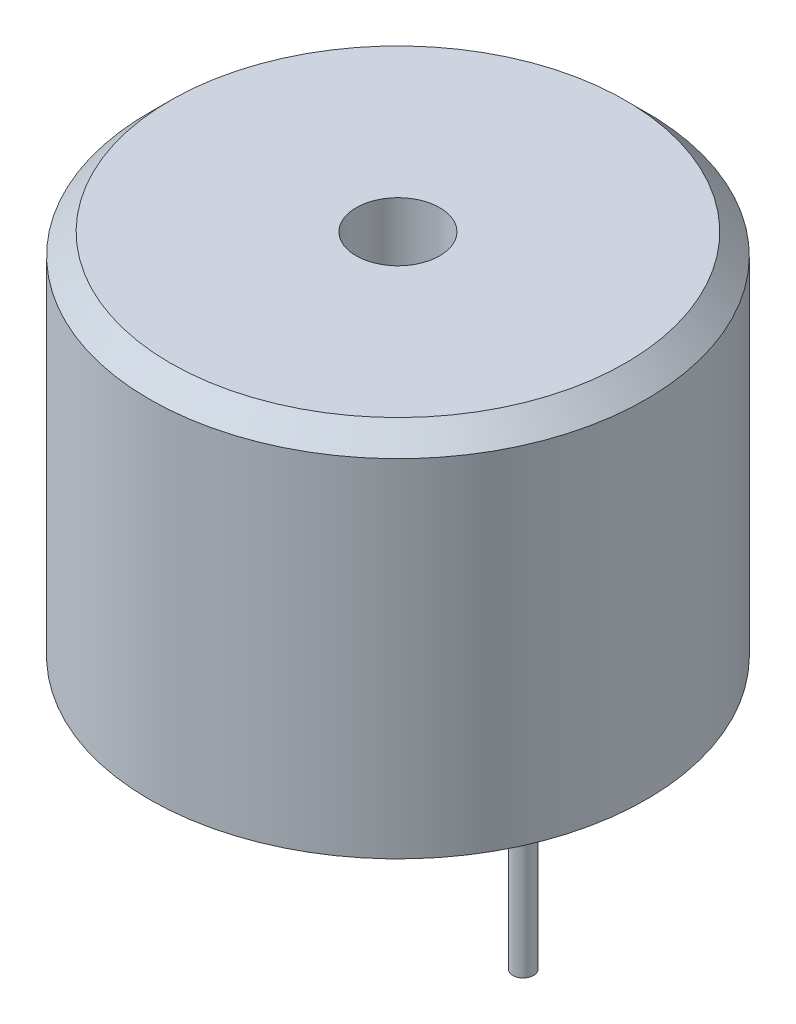
ISO-10303-21;
HEADER;
FILE_DESCRIPTION(('STEP AP214'),'2;1');
FILE_NAME('part.step','',(''),(''),'','','');
FILE_SCHEMA(('AUTOMOTIVE_DESIGN { 1 0 10303 214 1 1 1 1 }'));
ENDSEC;
DATA;
#1=APPLICATION_CONTEXT('core data for automotive mechanical design processes');
#2=APPLICATION_PROTOCOL_DEFINITION('international standard','automotive_design',2000,#1);
#3=PRODUCT_CONTEXT('',#1,'mechanical');
#4=PRODUCT('Part','Part','',(#3));
#5=PRODUCT_RELATED_PRODUCT_CATEGORY('part','',(#4));
#6=PRODUCT_DEFINITION_FORMATION('','',#4);
#7=PRODUCT_DEFINITION_CONTEXT('part definition',#1,'design');
#8=PRODUCT_DEFINITION('design','',#6,#7);
#9=PRODUCT_DEFINITION_SHAPE('','',#8);
#10=(LENGTH_UNIT() NAMED_UNIT(*) SI_UNIT(.MILLI.,.METRE.));
#11=(NAMED_UNIT(*) PLANE_ANGLE_UNIT() SI_UNIT($,.RADIAN.));
#12=(NAMED_UNIT(*) SI_UNIT($,.STERADIAN.) SOLID_ANGLE_UNIT());
#13=UNCERTAINTY_MEASURE_WITH_UNIT(LENGTH_MEASURE(1.E-05),#10,'distance_accuracy_value','');
#14=(GEOMETRIC_REPRESENTATION_CONTEXT(3) GLOBAL_UNCERTAINTY_ASSIGNED_CONTEXT((#13)) GLOBAL_UNIT_ASSIGNED_CONTEXT((#10,
#11,#12)) REPRESENTATION_CONTEXT('',''));
#15=CARTESIAN_POINT('',(0.,0.,0.));
#16=DIRECTION('',(0.,0.,1.));
#17=DIRECTION('',(1.,0.,0.));
#18=AXIS2_PLACEMENT_3D('',#15,#16,#17);
#19=CARTESIAN_POINT('',(0.,8.8,0.));
#20=DIRECTION('',(0.,-1.,0.));
#21=DIRECTION('',(0.,0.,-1.));
#22=AXIS2_PLACEMENT_3D('',#19,#20,#21);
#23=CYLINDRICAL_SURFACE('',#22,5.95);
#24=CARTESIAN_POINT('',(0.,8.3,0.));
#25=DIRECTION('',(0.,1.,0.));
#26=DIRECTION('',(0.,0.,1.));
#27=AXIS2_PLACEMENT_3D('',#24,#25,#26);
#28=CIRCLE('',#27,5.95);
#29=CARTESIAN_POINT('',(0.,8.3,5.95));
#30=VERTEX_POINT('',#29);
#31=EDGE_CURVE('E53',#30,#30,#28,.F.);
#32=ORIENTED_EDGE('',*,*,#31,.T.);
#33=EDGE_LOOP('',(#32));
#34=FACE_BOUND('',#33,.T.);
#35=CARTESIAN_POINT('',(0.,0.,0.));
#36=DIRECTION('',(0.,1.,0.));
#37=DIRECTION('',(0.,0.,1.));
#38=AXIS2_PLACEMENT_3D('',#35,#36,#37);
#39=CIRCLE('',#38,5.95);
#40=CARTESIAN_POINT('',(0.,0.,5.95));
#41=VERTEX_POINT('',#40);
#42=EDGE_CURVE('E61',#41,#41,#39,.T.);
#43=ORIENTED_EDGE('',*,*,#42,.T.);
#44=EDGE_LOOP('',(#43));
#45=FACE_BOUND('',#44,.T.);
#46=ADVANCED_FACE('F45',(#34,#45),#23,.T.);
#47=CARTESIAN_POINT('',(0.,8.8,0.));
#48=DIRECTION('',(0.,1.,0.));
#49=DIRECTION('',(0.,0.,1.));
#50=AXIS2_PLACEMENT_3D('',#47,#48,#49);
#51=PLANE('',#50);
#52=CARTESIAN_POINT('',(0.,8.8,0.));
#53=DIRECTION('',(0.,1.,0.));
#54=DIRECTION('',(0.,0.,1.));
#55=AXIS2_PLACEMENT_3D('',#52,#53,#54);
#56=CIRCLE('',#55,5.45);
#57=CARTESIAN_POINT('',(0.,8.8,5.45));
#58=VERTEX_POINT('',#57);
#59=EDGE_CURVE('E57',#58,#58,#56,.T.);
#60=ORIENTED_EDGE('',*,*,#59,.T.);
#61=EDGE_LOOP('',(#60));
#62=FACE_BOUND('',#61,.T.);
#63=CARTESIAN_POINT('',(0.,8.8,0.));
#64=DIRECTION('',(0.,1.,0.));
#65=DIRECTION('',(0.,0.,1.));
#66=AXIS2_PLACEMENT_3D('',#63,#64,#65);
#67=CIRCLE('',#66,1.);
#68=CARTESIAN_POINT('',(0.,8.8,1.));
#69=VERTEX_POINT('',#68);
#70=EDGE_CURVE('E67',#69,#69,#67,.T.);
#71=ORIENTED_EDGE('',*,*,#70,.F.);
#72=EDGE_LOOP('',(#71));
#73=FACE_BOUND('',#72,.T.);
#74=ADVANCED_FACE('F94',(#62,#73),#51,.T.);
#75=CARTESIAN_POINT('',(0.,0.,0.));
#76=DIRECTION('',(0.,1.,0.));
#77=DIRECTION('',(0.,0.,1.));
#78=AXIS2_PLACEMENT_3D('',#75,#76,#77);
#79=PLANE('',#78);
#80=CARTESIAN_POINT('',(3.,0.,0.));
#81=DIRECTION('',(0.,1.,0.));
#82=DIRECTION('',(0.,0.,-1.));
#83=AXIS2_PLACEMENT_3D('',#80,#81,#82);
#84=CIRCLE('',#83,0.25);
#85=CARTESIAN_POINT('',(3.,0.,-0.25));
#86=VERTEX_POINT('',#85);
#87=EDGE_CURVE('E76',#86,#86,#84,.T.);
#88=ORIENTED_EDGE('',*,*,#87,.T.);
#89=EDGE_LOOP('',(#88));
#90=FACE_BOUND('',#89,.T.);
#91=CARTESIAN_POINT('',(-3.,0.,0.));
#92=DIRECTION('',(0.,1.,0.));
#93=DIRECTION('',(0.,0.,1.));
#94=AXIS2_PLACEMENT_3D('',#91,#92,#93);
#95=CIRCLE('',#94,0.25);
#96=CARTESIAN_POINT('',(-3.,0.,0.25));
#97=VERTEX_POINT('',#96);
#98=EDGE_CURVE('E10',#97,#97,#95,.F.);
#99=ORIENTED_EDGE('',*,*,#98,.F.);
#100=EDGE_LOOP('',(#99));
#101=FACE_BOUND('',#100,.T.);
#102=ORIENTED_EDGE('',*,*,#42,.F.);
#103=EDGE_LOOP('',(#102));
#104=FACE_BOUND('',#103,.T.);
#105=ADVANCED_FACE('F99',(#90,#101,#104),#79,.F.);
#106=CARTESIAN_POINT('',(0.,6.8,0.));
#107=DIRECTION('',(0.,1.,0.));
#108=DIRECTION('',(0.,0.,1.));
#109=AXIS2_PLACEMENT_3D('',#106,#107,#108);
#110=CYLINDRICAL_SURFACE('',#109,1.);
#111=CARTESIAN_POINT('',(0.,6.8,0.));
#112=DIRECTION('',(0.,1.,0.));
#113=DIRECTION('',(0.,0.,1.));
#114=AXIS2_PLACEMENT_3D('',#111,#112,#113);
#115=CIRCLE('',#114,1.);
#116=CARTESIAN_POINT('',(0.,6.8,1.));
#117=VERTEX_POINT('',#116);
#118=EDGE_CURVE('E66',#117,#117,#115,.T.);
#119=ORIENTED_EDGE('',*,*,#118,.F.);
#120=EDGE_LOOP('',(#119));
#121=FACE_BOUND('',#120,.T.);
#122=ORIENTED_EDGE('',*,*,#70,.T.);
#123=EDGE_LOOP('',(#122));
#124=FACE_BOUND('',#123,.T.);
#125=ADVANCED_FACE('F105',(#121,#124),#110,.F.);
#126=CARTESIAN_POINT('',(0.,6.8,0.));
#127=DIRECTION('',(0.,1.,0.));
#128=DIRECTION('',(0.,0.,1.));
#129=AXIS2_PLACEMENT_3D('',#126,#127,#128);
#130=PLANE('',#129);
#131=ORIENTED_EDGE('',*,*,#118,.T.);
#132=EDGE_LOOP('',(#131));
#133=FACE_BOUND('',#132,.T.);
#134=ADVANCED_FACE('F110',(#133),#130,.T.);
#135=CARTESIAN_POINT('',(0.,8.8,0.));
#136=DIRECTION('',(0.,-1.,0.));
#137=DIRECTION('',(0.,0.,-1.));
#138=AXIS2_PLACEMENT_3D('',#135,#136,#137);
#139=CONICAL_SURFACE('',#138,5.45,0.785398163397448);
#140=ORIENTED_EDGE('',*,*,#31,.F.);
#141=EDGE_LOOP('',(#140));
#142=FACE_BOUND('',#141,.T.);
#143=ORIENTED_EDGE('',*,*,#59,.F.);
#144=EDGE_LOOP('',(#143));
#145=FACE_BOUND('',#144,.T.);
#146=ADVANCED_FACE('F48',(#142,#145),#139,.T.);
#147=CARTESIAN_POINT('',(-3.,-5.,0.));
#148=DIRECTION('',(0.,1.,0.));
#149=DIRECTION('',(0.,0.,1.));
#150=AXIS2_PLACEMENT_3D('',#147,#148,#149);
#151=CYLINDRICAL_SURFACE('',#150,0.25);
#152=CARTESIAN_POINT('',(-3.,-5.,0.));
#153=DIRECTION('',(0.,-1.,0.));
#154=DIRECTION('',(0.,0.,-1.));
#155=AXIS2_PLACEMENT_3D('',#152,#153,#154);
#156=CIRCLE('',#155,0.25);
#157=CARTESIAN_POINT('',(-3.,-5.,-0.25));
#158=VERTEX_POINT('',#157);
#159=EDGE_CURVE('E70',#158,#158,#156,.T.);
#160=ORIENTED_EDGE('',*,*,#159,.F.);
#161=EDGE_LOOP('',(#160));
#162=FACE_BOUND('',#161,.T.);
#163=ORIENTED_EDGE('',*,*,#98,.T.);
#164=EDGE_LOOP('',(#163));
#165=FACE_BOUND('',#164,.T.);
#166=ADVANCED_FACE('F115',(#162,#165),#151,.T.);
#167=CARTESIAN_POINT('',(-3.,-5.,0.));
#168=DIRECTION('',(0.,-1.,0.));
#169=DIRECTION('',(0.,0.,-1.));
#170=AXIS2_PLACEMENT_3D('',#167,#168,#169);
#171=PLANE('',#170);
#172=ORIENTED_EDGE('',*,*,#159,.T.);
#173=EDGE_LOOP('',(#172));
#174=FACE_BOUND('',#173,.T.);
#175=ADVANCED_FACE('F91',(#174),#171,.T.);
#176=CARTESIAN_POINT('',(3.,-5.,0.));
#177=DIRECTION('',(0.,1.,0.));
#178=DIRECTION('',(0.,0.,1.));
#179=AXIS2_PLACEMENT_3D('',#176,#177,#178);
#180=CYLINDRICAL_SURFACE('',#179,0.25);
#181=CARTESIAN_POINT('',(3.,-5.,0.));
#182=DIRECTION('',(0.,1.,0.));
#183=DIRECTION('',(0.,0.,-1.));
#184=AXIS2_PLACEMENT_3D('',#181,#182,#183);
#185=CIRCLE('',#184,0.25);
#186=CARTESIAN_POINT('',(3.,-5.,-0.25));
#187=VERTEX_POINT('',#186);
#188=EDGE_CURVE('E75',#187,#187,#185,.T.);
#189=ORIENTED_EDGE('',*,*,#188,.T.);
#190=EDGE_LOOP('',(#189));
#191=FACE_BOUND('',#190,.T.);
#192=ORIENTED_EDGE('',*,*,#87,.F.);
#193=EDGE_LOOP('',(#192));
#194=FACE_BOUND('',#193,.T.);
#195=ADVANCED_FACE('F82',(#191,#194),#180,.T.);
#196=CARTESIAN_POINT('',(3.,-5.,0.));
#197=DIRECTION('',(0.,-1.,0.));
#198=DIRECTION('',(0.,0.,-1.));
#199=AXIS2_PLACEMENT_3D('',#196,#197,#198);
#200=PLANE('',#199);
#201=ORIENTED_EDGE('',*,*,#188,.F.);
#202=EDGE_LOOP('',(#201));
#203=FACE_BOUND('',#202,.T.);
#204=ADVANCED_FACE('F85',(#203),#200,.T.);
#205=CLOSED_SHELL('',(#46,#74,#105,#125,#134,#146,#166,#175,#195,#204));
#206=MANIFOLD_SOLID_BREP('B2',#205);
#207=ADVANCED_BREP_SHAPE_REPRESENTATION('',(#18,#206),#14);
#208=SHAPE_DEFINITION_REPRESENTATION(#9,#207);
ENDSEC;
END-ISO-10303-21;
